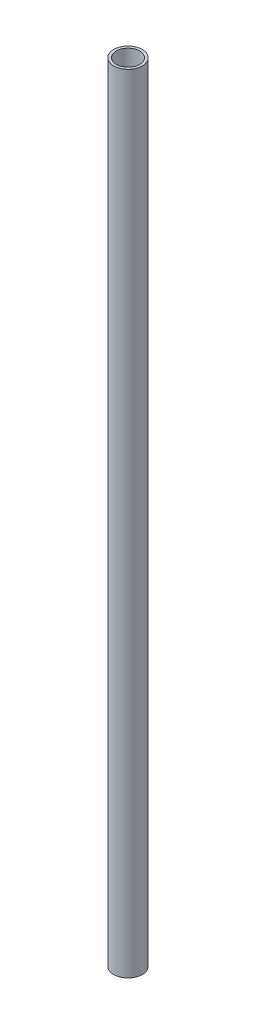
ISO-10303-21;
HEADER;
FILE_DESCRIPTION(('STEP AP214'),'2;1');
FILE_NAME('part.step','',(''),(''),'','','');
FILE_SCHEMA(('AUTOMOTIVE_DESIGN { 1 0 10303 214 1 1 1 1 }'));
ENDSEC;
DATA;
#1=APPLICATION_CONTEXT('core data for automotive mechanical design processes');
#2=APPLICATION_PROTOCOL_DEFINITION('international standard','automotive_design',2000,#1);
#3=PRODUCT_CONTEXT('',#1,'mechanical');
#4=PRODUCT('Part','Part','',(#3));
#5=PRODUCT_RELATED_PRODUCT_CATEGORY('part','',(#4));
#6=PRODUCT_DEFINITION_FORMATION('','',#4);
#7=PRODUCT_DEFINITION_CONTEXT('part definition',#1,'design');
#8=PRODUCT_DEFINITION('design','',#6,#7);
#9=PRODUCT_DEFINITION_SHAPE('','',#8);
#10=(LENGTH_UNIT() NAMED_UNIT(*) SI_UNIT(.MILLI.,.METRE.));
#11=(NAMED_UNIT(*) PLANE_ANGLE_UNIT() SI_UNIT($,.RADIAN.));
#12=(NAMED_UNIT(*) SI_UNIT($,.STERADIAN.) SOLID_ANGLE_UNIT());
#13=UNCERTAINTY_MEASURE_WITH_UNIT(LENGTH_MEASURE(1.E-05),#10,'distance_accuracy_value','');
#14=(GEOMETRIC_REPRESENTATION_CONTEXT(3) GLOBAL_UNCERTAINTY_ASSIGNED_CONTEXT((#13)) GLOBAL_UNIT_ASSIGNED_CONTEXT((#10,
#11,#12)) REPRESENTATION_CONTEXT('',''));
#15=CARTESIAN_POINT('',(0.,0.,0.));
#16=DIRECTION('',(0.,0.,1.));
#17=DIRECTION('',(1.,0.,0.));
#18=AXIS2_PLACEMENT_3D('',#15,#16,#17);
#19=CARTESIAN_POINT('',(0.,1160.4625,0.));
#20=DIRECTION('',(0.,1.,0.));
#21=DIRECTION('',(0.,0.,1.));
#22=AXIS2_PLACEMENT_3D('',#19,#20,#21);
#23=PLANE('',#22);
#24=CARTESIAN_POINT('',(0.,1160.4625,0.));
#25=DIRECTION('',(0.,1.,0.));
#26=DIRECTION('',(0.,0.,1.));
#27=AXIS2_PLACEMENT_3D('',#24,#25,#26);
#28=CIRCLE('',#27,21.082);
#29=CARTESIAN_POINT('',(0.,1160.4625,21.082));
#30=VERTEX_POINT('',#29);
#31=EDGE_CURVE('E10',#30,#30,#28,.T.);
#32=ORIENTED_EDGE('',*,*,#31,.T.);
#33=EDGE_LOOP('',(#32));
#34=FACE_BOUND('',#33,.T.);
#35=CARTESIAN_POINT('',(0.,1160.4625,0.));
#36=DIRECTION('',(0.,1.,0.));
#37=DIRECTION('',(0.,0.,1.));
#38=AXIS2_PLACEMENT_3D('',#35,#36,#37);
#39=CIRCLE('',#38,17.272);
#40=CARTESIAN_POINT('',(0.,1160.4625,17.272));
#41=VERTEX_POINT('',#40);
#42=EDGE_CURVE('E42',#41,#41,#39,.T.);
#43=ORIENTED_EDGE('',*,*,#42,.F.);
#44=EDGE_LOOP('',(#43));
#45=FACE_BOUND('',#44,.T.);
#46=ADVANCED_FACE('F31',(#34,#45),#23,.T.);
#47=CARTESIAN_POINT('',(0.,0.,0.));
#48=DIRECTION('',(0.,1.,0.));
#49=DIRECTION('',(0.,0.,1.));
#50=AXIS2_PLACEMENT_3D('',#47,#48,#49);
#51=PLANE('',#50);
#52=CARTESIAN_POINT('',(0.,0.,0.));
#53=DIRECTION('',(0.,1.,0.));
#54=DIRECTION('',(0.,0.,1.));
#55=AXIS2_PLACEMENT_3D('',#52,#53,#54);
#56=CIRCLE('',#55,21.082);
#57=CARTESIAN_POINT('',(0.,0.,21.082));
#58=VERTEX_POINT('',#57);
#59=EDGE_CURVE('E35',#58,#58,#56,.T.);
#60=ORIENTED_EDGE('',*,*,#59,.F.);
#61=EDGE_LOOP('',(#60));
#62=FACE_BOUND('',#61,.T.);
#63=CARTESIAN_POINT('',(0.,0.,0.));
#64=DIRECTION('',(0.,1.,0.));
#65=DIRECTION('',(0.,0.,1.));
#66=AXIS2_PLACEMENT_3D('',#63,#64,#65);
#67=CIRCLE('',#66,17.272);
#68=CARTESIAN_POINT('',(0.,0.,17.272));
#69=VERTEX_POINT('',#68);
#70=EDGE_CURVE('E44',#69,#69,#67,.T.);
#71=ORIENTED_EDGE('',*,*,#70,.T.);
#72=EDGE_LOOP('',(#71));
#73=FACE_BOUND('',#72,.T.);
#74=ADVANCED_FACE('F54',(#62,#73),#51,.F.);
#75=CARTESIAN_POINT('',(0.,1160.4625,0.));
#76=DIRECTION('',(0.,-1.,0.));
#77=DIRECTION('',(0.,0.,-1.));
#78=AXIS2_PLACEMENT_3D('',#75,#76,#77);
#79=CYLINDRICAL_SURFACE('',#78,21.082);
#80=ORIENTED_EDGE('',*,*,#31,.F.);
#81=EDGE_LOOP('',(#80));
#82=FACE_BOUND('',#81,.T.);
#83=ORIENTED_EDGE('',*,*,#59,.T.);
#84=EDGE_LOOP('',(#83));
#85=FACE_BOUND('',#84,.T.);
#86=ADVANCED_FACE('F33',(#82,#85),#79,.T.);
#87=CARTESIAN_POINT('',(0.,1160.4625,0.));
#88=DIRECTION('',(0.,-1.,0.));
#89=DIRECTION('',(0.,0.,-1.));
#90=AXIS2_PLACEMENT_3D('',#87,#88,#89);
#91=CYLINDRICAL_SURFACE('',#90,17.272);
#92=ORIENTED_EDGE('',*,*,#42,.T.);
#93=EDGE_LOOP('',(#92));
#94=FACE_BOUND('',#93,.T.);
#95=ORIENTED_EDGE('',*,*,#70,.F.);
#96=EDGE_LOOP('',(#95));
#97=FACE_BOUND('',#96,.T.);
#98=ADVANCED_FACE('F50',(#94,#97),#91,.F.);
#99=CLOSED_SHELL('',(#46,#74,#86,#98));
#100=MANIFOLD_SOLID_BREP('B2',#99);
#101=ADVANCED_BREP_SHAPE_REPRESENTATION('',(#18,#100),#14);
#102=SHAPE_DEFINITION_REPRESENTATION(#9,#101);
ENDSEC;
END-ISO-10303-21;
